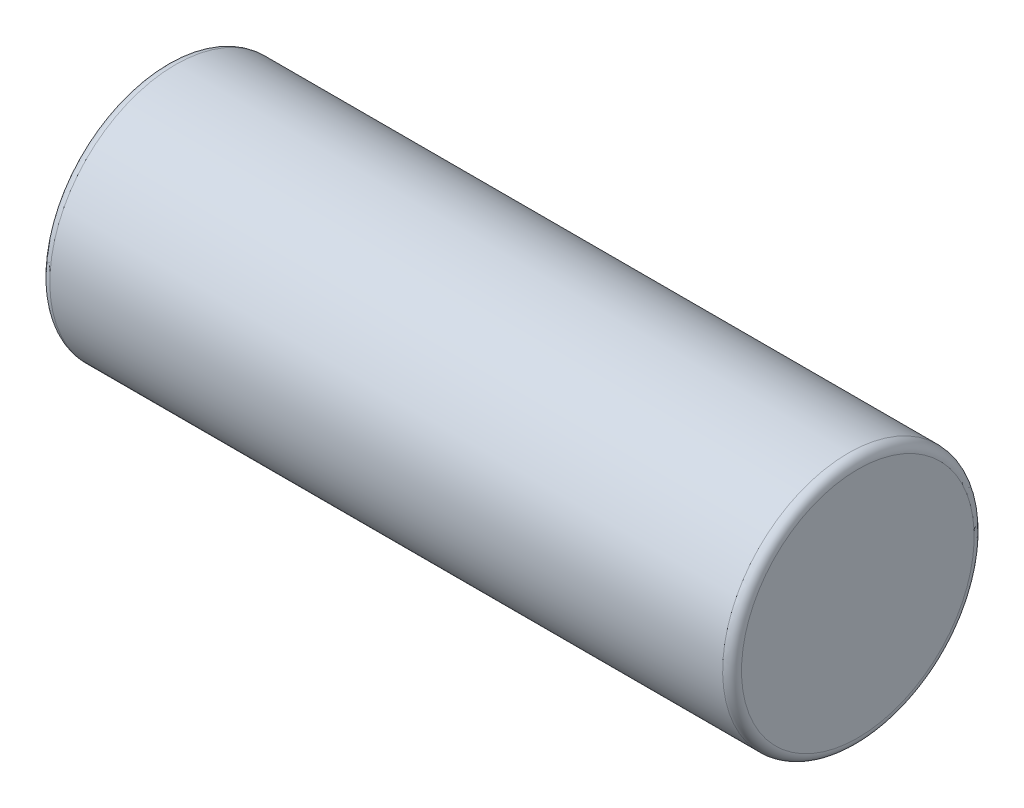
ISO-10303-21;
HEADER;
FILE_DESCRIPTION(('STEP AP214'),'2;1');
FILE_NAME('part.step','',(''),(''),'','','');
FILE_SCHEMA(('AUTOMOTIVE_DESIGN { 1 0 10303 214 1 1 1 1 }'));
ENDSEC;
DATA;
#1=APPLICATION_CONTEXT('core data for automotive mechanical design processes');
#2=APPLICATION_PROTOCOL_DEFINITION('international standard','automotive_design',2000,#1);
#3=PRODUCT_CONTEXT('',#1,'mechanical');
#4=PRODUCT('Part','Part','',(#3));
#5=PRODUCT_RELATED_PRODUCT_CATEGORY('part','',(#4));
#6=PRODUCT_DEFINITION_FORMATION('','',#4);
#7=PRODUCT_DEFINITION_CONTEXT('part definition',#1,'design');
#8=PRODUCT_DEFINITION('design','',#6,#7);
#9=PRODUCT_DEFINITION_SHAPE('','',#8);
#10=(LENGTH_UNIT() NAMED_UNIT(*) SI_UNIT(.MILLI.,.METRE.));
#11=(NAMED_UNIT(*) PLANE_ANGLE_UNIT() SI_UNIT($,.RADIAN.));
#12=(NAMED_UNIT(*) SI_UNIT($,.STERADIAN.) SOLID_ANGLE_UNIT());
#13=UNCERTAINTY_MEASURE_WITH_UNIT(LENGTH_MEASURE(1.E-05),#10,'distance_accuracy_value','');
#14=(GEOMETRIC_REPRESENTATION_CONTEXT(3) GLOBAL_UNCERTAINTY_ASSIGNED_CONTEXT((#13)) GLOBAL_UNIT_ASSIGNED_CONTEXT((#10,
#11,#12)) REPRESENTATION_CONTEXT('',''));
#15=CARTESIAN_POINT('',(0.,0.,0.));
#16=DIRECTION('',(0.,0.,1.));
#17=DIRECTION('',(1.,0.,0.));
#18=AXIS2_PLACEMENT_3D('',#15,#16,#17);
#19=CARTESIAN_POINT('',(36.55,0.,-25.425));
#20=DIRECTION('',(1.,0.,0.));
#21=DIRECTION('',(0.,0.,-1.));
#22=AXIS2_PLACEMENT_3D('',#19,#20,#21);
#23=PLANE('',#22);
#24=CARTESIAN_POINT('',(36.55,0.,-24.5));
#25=DIRECTION('',(-1.,0.,0.));
#26=DIRECTION('',(0.,1.,0.));
#27=AXIS2_PLACEMENT_3D('',#24,#25,#26);
#28=CIRCLE('',#27,1.85);
#29=CARTESIAN_POINT('',(36.55,1.85,-24.5));
#30=VERTEX_POINT('',#29);
#31=CARTESIAN_POINT('',(36.55,-1.85,-24.5));
#32=VERTEX_POINT('',#31);
#33=EDGE_CURVE('E45',#30,#32,#28,.T.);
#34=ORIENTED_EDGE('',*,*,#33,.F.);
#35=CARTESIAN_POINT('',(36.55,0.,-24.5));
#36=DIRECTION('',(-1.,0.,0.));
#37=DIRECTION('',(0.,-1.,0.));
#38=AXIS2_PLACEMENT_3D('',#35,#36,#37);
#39=CIRCLE('',#38,1.85);
#40=EDGE_CURVE('E49',#32,#30,#39,.T.);
#41=ORIENTED_EDGE('',*,*,#40,.F.);
#42=EDGE_LOOP('',(#34,#41));
#43=FACE_BOUND('',#42,.T.);
#44=ADVANCED_FACE('F16',(#43),#23,.T.);
#45=CARTESIAN_POINT('',(25.55,0.,-25.425));
#46=DIRECTION('',(-1.,0.,0.));
#47=DIRECTION('',(0.,-1.,0.));
#48=AXIS2_PLACEMENT_3D('',#45,#46,#47);
#49=PLANE('',#48);
#50=CARTESIAN_POINT('',(25.55,0.,-24.5));
#51=DIRECTION('',(1.,0.,0.));
#52=DIRECTION('',(0.,1.,0.));
#53=AXIS2_PLACEMENT_3D('',#50,#51,#52);
#54=CIRCLE('',#53,1.85);
#55=CARTESIAN_POINT('',(25.55,1.85,-24.5));
#56=VERTEX_POINT('',#55);
#57=CARTESIAN_POINT('',(25.55,-1.85,-24.5));
#58=VERTEX_POINT('',#57);
#59=EDGE_CURVE('E36',#56,#58,#54,.T.);
#60=ORIENTED_EDGE('',*,*,#59,.F.);
#61=CARTESIAN_POINT('',(25.55,0.,-24.5));
#62=DIRECTION('',(1.,0.,0.));
#63=DIRECTION('',(0.,-1.,0.));
#64=AXIS2_PLACEMENT_3D('',#61,#62,#63);
#65=CIRCLE('',#64,1.85);
#66=EDGE_CURVE('E92',#58,#56,#65,.T.);
#67=ORIENTED_EDGE('',*,*,#66,.F.);
#68=EDGE_LOOP('',(#60,#67));
#69=FACE_BOUND('',#68,.T.);
#70=ADVANCED_FACE('F71',(#69),#49,.T.);
#71=CARTESIAN_POINT('',(36.4,0.,-24.5));
#72=DIRECTION('',(-1.,0.,0.));
#73=DIRECTION('',(0.,1.,0.));
#74=AXIS2_PLACEMENT_3D('',#71,#72,#73);
#75=TOROIDAL_SURFACE('',#74,1.85,0.15);
#76=CARTESIAN_POINT('',(36.4,0.,-24.5));
#77=DIRECTION('',(1.,0.,0.));
#78=DIRECTION('',(0.,1.,0.));
#79=AXIS2_PLACEMENT_3D('',#76,#77,#78);
#80=CIRCLE('',#79,2.);
#81=CARTESIAN_POINT('',(36.4,2.,-24.5));
#82=VERTEX_POINT('',#81);
#83=EDGE_CURVE('E28',#82,#82,#80,.F.);
#84=ORIENTED_EDGE('',*,*,#83,.F.);
#85=EDGE_LOOP('',(#84));
#86=FACE_BOUND('',#85,.T.);
#87=ORIENTED_EDGE('',*,*,#40,.T.);
#88=ORIENTED_EDGE('',*,*,#33,.T.);
#89=EDGE_LOOP('',(#87,#88));
#90=FACE_BOUND('',#89,.T.);
#91=ADVANCED_FACE('F53',(#86,#90),#75,.T.);
#92=CARTESIAN_POINT('',(25.7,0.,-24.5));
#93=DIRECTION('',(-1.,0.,0.));
#94=DIRECTION('',(0.,1.,0.));
#95=AXIS2_PLACEMENT_3D('',#92,#93,#94);
#96=TOROIDAL_SURFACE('',#95,1.85,0.15);
#97=CARTESIAN_POINT('',(25.7,0.,-24.5));
#98=DIRECTION('',(1.,0.,0.));
#99=DIRECTION('',(0.,1.,0.));
#100=AXIS2_PLACEMENT_3D('',#97,#98,#99);
#101=CIRCLE('',#100,2.);
#102=CARTESIAN_POINT('',(25.7,2.,-24.5));
#103=VERTEX_POINT('',#102);
#104=EDGE_CURVE('E11',#103,#103,#101,.T.);
#105=ORIENTED_EDGE('',*,*,#104,.F.);
#106=EDGE_LOOP('',(#105));
#107=FACE_BOUND('',#106,.T.);
#108=ORIENTED_EDGE('',*,*,#66,.T.);
#109=ORIENTED_EDGE('',*,*,#59,.T.);
#110=EDGE_LOOP('',(#108,#109));
#111=FACE_BOUND('',#110,.T.);
#112=ADVANCED_FACE('F70',(#107,#111),#96,.T.);
#113=CARTESIAN_POINT('',(31.05,0.,-24.5));
#114=DIRECTION('',(1.,0.,0.));
#115=DIRECTION('',(0.,1.,0.));
#116=AXIS2_PLACEMENT_3D('',#113,#114,#115);
#117=CYLINDRICAL_SURFACE('',#116,2.);
#118=ORIENTED_EDGE('',*,*,#83,.T.);
#119=EDGE_LOOP('',(#118));
#120=FACE_BOUND('',#119,.T.);
#121=ORIENTED_EDGE('',*,*,#104,.T.);
#122=EDGE_LOOP('',(#121));
#123=FACE_BOUND('',#122,.T.);
#124=ADVANCED_FACE('F112',(#120,#123),#117,.T.);
#125=CLOSED_SHELL('',(#44,#70,#91,#112,#124));
#126=MANIFOLD_SOLID_BREP('B1',#125);
#127=ADVANCED_BREP_SHAPE_REPRESENTATION('',(#18,#126),#14);
#128=SHAPE_DEFINITION_REPRESENTATION(#9,#127);
ENDSEC;
END-ISO-10303-21;
